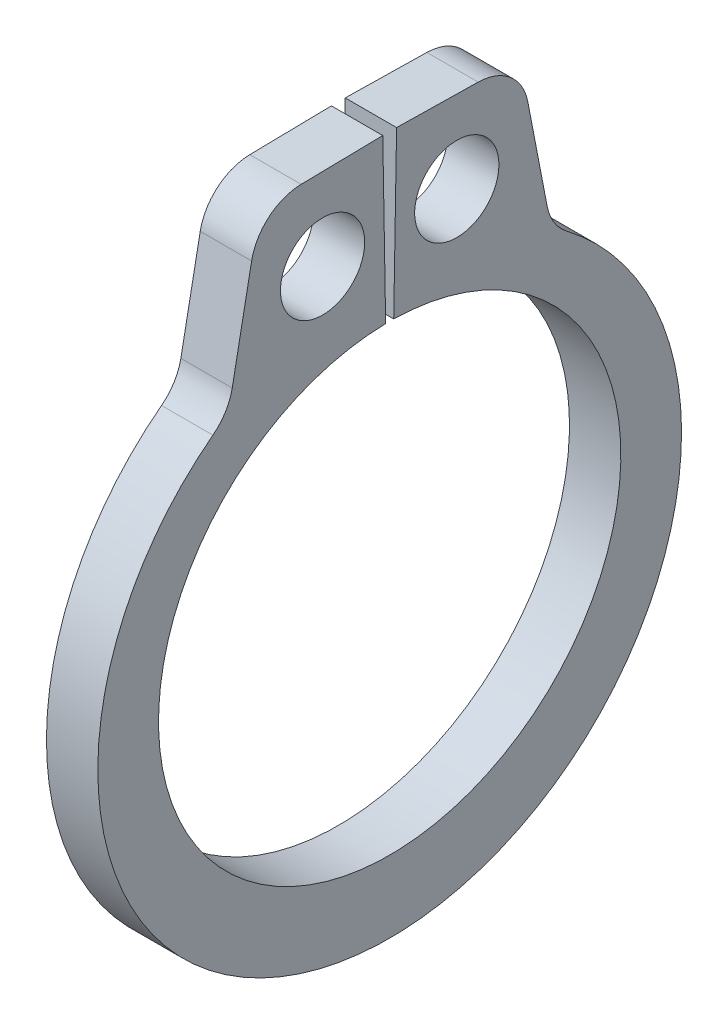
ISO-10303-21;
HEADER;
FILE_DESCRIPTION(('STEP AP214'),'2;1');
FILE_NAME('part.step','',(''),(''),'','','');
FILE_SCHEMA(('AUTOMOTIVE_DESIGN { 1 0 10303 214 1 1 1 1 }'));
ENDSEC;
DATA;
#1=APPLICATION_CONTEXT('core data for automotive mechanical design processes');
#2=APPLICATION_PROTOCOL_DEFINITION('international standard','automotive_design',2000,#1);
#3=PRODUCT_CONTEXT('',#1,'mechanical');
#4=PRODUCT('Part','Part','',(#3));
#5=PRODUCT_RELATED_PRODUCT_CATEGORY('part','',(#4));
#6=PRODUCT_DEFINITION_FORMATION('','',#4);
#7=PRODUCT_DEFINITION_CONTEXT('part definition',#1,'design');
#8=PRODUCT_DEFINITION('design','',#6,#7);
#9=PRODUCT_DEFINITION_SHAPE('','',#8);
#10=(LENGTH_UNIT() NAMED_UNIT(*) SI_UNIT(.MILLI.,.METRE.));
#11=(NAMED_UNIT(*) PLANE_ANGLE_UNIT() SI_UNIT($,.RADIAN.));
#12=(NAMED_UNIT(*) SI_UNIT($,.STERADIAN.) SOLID_ANGLE_UNIT());
#13=UNCERTAINTY_MEASURE_WITH_UNIT(LENGTH_MEASURE(1.E-05),#10,'distance_accuracy_value','');
#14=(GEOMETRIC_REPRESENTATION_CONTEXT(3) GLOBAL_UNCERTAINTY_ASSIGNED_CONTEXT((#13)) GLOBAL_UNIT_ASSIGNED_CONTEXT((#10,
#11,#12)) REPRESENTATION_CONTEXT('',''));
#15=CARTESIAN_POINT('',(0.,0.,0.));
#16=DIRECTION('',(0.,0.,1.));
#17=DIRECTION('',(1.,0.,0.));
#18=AXIS2_PLACEMENT_3D('',#15,#16,#17);
#19=CARTESIAN_POINT('',(0.3175,0.,0.));
#20=DIRECTION('',(1.,0.,0.));
#21=DIRECTION('',(0.,0.,-1.));
#22=AXIS2_PLACEMENT_3D('',#19,#20,#21);
#23=PLANE('',#22);
#24=CARTESIAN_POINT('',(0.3175,3.85961131348306,0.829485840043991));
#25=DIRECTION('',(1.,0.,0.));
#26=DIRECTION('',(0.,0.,-1.));
#27=AXIS2_PLACEMENT_3D('',#24,#25,#26);
#28=CIRCLE('',#27,0.5207);
#29=CARTESIAN_POINT('',(0.3175,3.85961131348306,0.308785840043991));
#30=VERTEX_POINT('',#29);
#31=EDGE_CURVE('E221',#30,#30,#28,.T.);
#32=ORIENTED_EDGE('',*,*,#31,.F.);
#33=EDGE_LOOP('',(#32));
#34=FACE_BOUND('',#33,.T.);
#35=DIRECTION('',(0.,-0.017452406437292,0.999847695156391));
#36=VECTOR('',#35,1.);
#37=CARTESIAN_POINT('',(0.3175,4.88875530546717,0.085333541275098));
#38=LINE('',#37,#36);
#39=CARTESIAN_POINT('',(0.3175,4.88875530546717,0.085333541275098));
#40=VERTEX_POINT('',#39);
#41=CARTESIAN_POINT('',(0.3175,4.87114314790031,1.09433337251507));
#42=VERTEX_POINT('',#41);
#43=EDGE_CURVE('E133',#40,#42,#38,.T.);
#44=ORIENTED_EDGE('',*,*,#43,.T.);
#45=CARTESIAN_POINT('',(0.3175,4.236239861476,1.08325109442739));
#46=DIRECTION('',(1.,0.,0.));
#47=DIRECTION('',(0.,0.,-1.));
#48=AXIS2_PLACEMENT_3D('',#45,#46,#47);
#49=CIRCLE('',#48,0.635);
#50=CARTESIAN_POINT('',(0.3175,4.35665257048609,1.7067298667275));
#51=VERTEX_POINT('',#50);
#52=EDGE_CURVE('E174',#42,#51,#49,.T.);
#53=ORIENTED_EDGE('',*,*,#52,.T.);
#54=DIRECTION('',(0.,-0.981856334330881,0.189626313401717));
#55=VECTOR('',#54,1.);
#56=CARTESIAN_POINT('',(0.3175,4.86215783805674,1.60910142869344));
#57=LINE('',#56,#55);
#58=CARTESIAN_POINT('',(0.3175,3.1162207377056,1.94629497136839));
#59=VERTEX_POINT('',#58);
#60=EDGE_CURVE('E213',#51,#59,#57,.T.);
#61=ORIENTED_EDGE('',*,*,#60,.T.);
#62=CARTESIAN_POINT('',(0.3175,3.23663344671569,2.5697737436685));
#63=DIRECTION('',(1.,0.,0.));
#64=DIRECTION('',(0.,0.,-1.));
#65=AXIS2_PLACEMENT_3D('',#62,#63,#64);
#66=CIRCLE('',#65,0.635);
#67=CARTESIAN_POINT('',(0.3175,2.73137951372647,2.18513954966213));
#68=VERTEX_POINT('',#67);
#69=EDGE_CURVE('E181',#59,#68,#66,.F.);
#70=ORIENTED_EDGE('',*,*,#69,.T.);
#71=CARTESIAN_POINT('',(0.3175,-0.139011025651324,0.));
#72=DIRECTION('',(1.,0.,0.));
#73=DIRECTION('',(0.,0.,-1.));
#74=AXIS2_PLACEMENT_3D('',#71,#72,#73);
#75=CIRCLE('',#74,3.60748897434866);
#76=CARTESIAN_POINT('',(0.3175,2.73137951372647,-2.18513954966213));
#77=VERTEX_POINT('',#76);
#78=EDGE_CURVE('E206',#68,#77,#75,.T.);
#79=ORIENTED_EDGE('',*,*,#78,.T.);
#80=CARTESIAN_POINT('',(0.3175,3.23663344671569,-2.5697737436685));
#81=DIRECTION('',(1.,0.,0.));
#82=DIRECTION('',(0.,0.,-1.));
#83=AXIS2_PLACEMENT_3D('',#80,#81,#82);
#84=CIRCLE('',#83,0.635);
#85=CARTESIAN_POINT('',(0.3175,3.1162207377056,-1.94629497136839));
#86=VERTEX_POINT('',#85);
#87=EDGE_CURVE('E11',#77,#86,#84,.F.);
#88=ORIENTED_EDGE('',*,*,#87,.T.);
#89=DIRECTION('',(0.,0.981856334330881,0.189626313401717));
#90=VECTOR('',#89,1.);
#91=CARTESIAN_POINT('',(0.3175,4.86215783805674,-1.60910142869344));
#92=LINE('',#91,#90);
#93=CARTESIAN_POINT('',(0.3175,4.35665257048609,-1.7067298667275));
#94=VERTEX_POINT('',#93);
#95=EDGE_CURVE('E205',#86,#94,#92,.T.);
#96=ORIENTED_EDGE('',*,*,#95,.T.);
#97=CARTESIAN_POINT('',(0.3175,4.236239861476,-1.08325109442739));
#98=DIRECTION('',(1.,0.,0.));
#99=DIRECTION('',(0.,0.,-1.));
#100=AXIS2_PLACEMENT_3D('',#97,#98,#99);
#101=CIRCLE('',#100,0.635);
#102=CARTESIAN_POINT('',(0.3175,4.87114314790031,-1.09433337251507));
#103=VERTEX_POINT('',#102);
#104=EDGE_CURVE('E49',#94,#103,#101,.T.);
#105=ORIENTED_EDGE('',*,*,#104,.T.);
#106=DIRECTION('',(0.,0.017452406437292,0.999847695156391));
#107=VECTOR('',#106,1.);
#108=CARTESIAN_POINT('',(0.3175,4.88875530546717,-0.085333541275098));
#109=LINE('',#108,#107);
#110=CARTESIAN_POINT('',(0.3175,4.88875530546717,-0.085333541275098));
#111=VERTEX_POINT('',#110);
#112=EDGE_CURVE('E210',#103,#111,#109,.T.);
#113=ORIENTED_EDGE('',*,*,#112,.T.);
#114=DIRECTION('',(0.,-0.999847695156391,0.0174524064372837));
#115=VECTOR('',#114,1.);
#116=CARTESIAN_POINT('',(0.3175,2.85706478890939,-0.0498702513945376));
#117=LINE('',#116,#115);
#118=CARTESIAN_POINT('',(0.3175,2.85706478890939,-0.0498702513945376));
#119=VERTEX_POINT('',#118);
#120=EDGE_CURVE('E139',#111,#119,#117,.T.);
#121=ORIENTED_EDGE('',*,*,#120,.T.);
#122=CARTESIAN_POINT('',(0.3175,0.,0.));
#123=DIRECTION('',(-1.,0.,0.));
#124=DIRECTION('',(0.,0.,-1.));
#125=AXIS2_PLACEMENT_3D('',#122,#123,#124);
#126=CIRCLE('',#125,2.8575);
#127=CARTESIAN_POINT('',(0.3175,2.85706478890939,0.0498702513945376));
#128=VERTEX_POINT('',#127);
#129=EDGE_CURVE('E134',#119,#128,#126,.T.);
#130=ORIENTED_EDGE('',*,*,#129,.T.);
#131=DIRECTION('',(0.,0.999847695156391,0.0174524064372837));
#132=VECTOR('',#131,1.);
#133=CARTESIAN_POINT('',(0.3175,2.85706478890939,0.0498702513945376));
#134=LINE('',#133,#132);
#135=EDGE_CURVE('E125',#128,#40,#134,.T.);
#136=ORIENTED_EDGE('',*,*,#135,.T.);
#137=EDGE_LOOP('',(#44,#53,#61,#70,#79,#88,#96,#105,#113,#121,#130,#136));
#138=FACE_BOUND('',#137,.T.);
#139=CARTESIAN_POINT('',(0.3175,3.85961131348306,-0.829485840043991));
#140=DIRECTION('',(1.,0.,0.));
#141=DIRECTION('',(0.,0.,-1.));
#142=AXIS2_PLACEMENT_3D('',#139,#140,#141);
#143=CIRCLE('',#142,0.5207);
#144=CARTESIAN_POINT('',(0.3175,3.85961131348306,-1.35018584004399));
#145=VERTEX_POINT('',#144);
#146=EDGE_CURVE('E247',#145,#145,#143,.T.);
#147=ORIENTED_EDGE('',*,*,#146,.F.);
#148=EDGE_LOOP('',(#147));
#149=FACE_BOUND('',#148,.T.);
#150=ADVANCED_FACE('F34',(#34,#138,#149),#23,.T.);
#151=CARTESIAN_POINT('',(-0.3175,0.,0.));
#152=DIRECTION('',(1.,0.,0.));
#153=DIRECTION('',(0.,0.,-1.));
#154=AXIS2_PLACEMENT_3D('',#151,#152,#153);
#155=PLANE('',#154);
#156=CARTESIAN_POINT('',(-0.3175,3.85961131348306,0.829485840043991));
#157=DIRECTION('',(1.,0.,0.));
#158=DIRECTION('',(0.,0.,-1.));
#159=AXIS2_PLACEMENT_3D('',#156,#157,#158);
#160=CIRCLE('',#159,0.5207);
#161=CARTESIAN_POINT('',(-0.3175,3.85961131348306,0.308785840043991));
#162=VERTEX_POINT('',#161);
#163=EDGE_CURVE('E244',#162,#162,#160,.T.);
#164=ORIENTED_EDGE('',*,*,#163,.T.);
#165=EDGE_LOOP('',(#164));
#166=FACE_BOUND('',#165,.T.);
#167=DIRECTION('',(0.,-0.981856334330881,0.189626313401717));
#168=VECTOR('',#167,1.);
#169=CARTESIAN_POINT('',(-0.3175,4.86215783805674,1.60910142869344));
#170=LINE('',#169,#168);
#171=CARTESIAN_POINT('',(-0.3175,4.35665257048609,1.7067298667275));
#172=VERTEX_POINT('',#171);
#173=CARTESIAN_POINT('',(-0.3175,3.1162207377056,1.94629497136839));
#174=VERTEX_POINT('',#173);
#175=EDGE_CURVE('E200',#172,#174,#170,.T.);
#176=ORIENTED_EDGE('',*,*,#175,.F.);
#177=CARTESIAN_POINT('',(-0.3175,4.236239861476,1.08325109442739));
#178=DIRECTION('',(1.,0.,0.));
#179=DIRECTION('',(0.,0.,-1.));
#180=AXIS2_PLACEMENT_3D('',#177,#178,#179);
#181=CIRCLE('',#180,0.635);
#182=CARTESIAN_POINT('',(-0.3175,4.87114314790031,1.09433337251507));
#183=VERTEX_POINT('',#182);
#184=EDGE_CURVE('E170',#172,#183,#181,.F.);
#185=ORIENTED_EDGE('',*,*,#184,.T.);
#186=DIRECTION('',(0.,-0.017452406437292,0.999847695156391));
#187=VECTOR('',#186,1.);
#188=CARTESIAN_POINT('',(-0.3175,4.88875530546717,0.085333541275098));
#189=LINE('',#188,#187);
#190=CARTESIAN_POINT('',(-0.3175,4.88875530546717,0.085333541275098));
#191=VERTEX_POINT('',#190);
#192=EDGE_CURVE('E223',#191,#183,#189,.T.);
#193=ORIENTED_EDGE('',*,*,#192,.F.);
#194=DIRECTION('',(0.,0.999847695156391,0.0174524064372837));
#195=VECTOR('',#194,1.);
#196=CARTESIAN_POINT('',(-0.3175,2.85706478890939,0.0498702513945376));
#197=LINE('',#196,#195);
#198=CARTESIAN_POINT('',(-0.3175,2.85706478890939,0.0498702513945376));
#199=VERTEX_POINT('',#198);
#200=EDGE_CURVE('E220',#199,#191,#197,.T.);
#201=ORIENTED_EDGE('',*,*,#200,.F.);
#202=CARTESIAN_POINT('',(-0.3175,0.,0.));
#203=DIRECTION('',(-1.,0.,0.));
#204=DIRECTION('',(0.,0.,-1.));
#205=AXIS2_PLACEMENT_3D('',#202,#203,#204);
#206=CIRCLE('',#205,2.8575);
#207=CARTESIAN_POINT('',(-0.3175,2.85706478890939,-0.0498702513945376));
#208=VERTEX_POINT('',#207);
#209=EDGE_CURVE('E147',#208,#199,#206,.T.);
#210=ORIENTED_EDGE('',*,*,#209,.F.);
#211=DIRECTION('',(0.,-0.999847695156391,0.0174524064372837));
#212=VECTOR('',#211,1.);
#213=CARTESIAN_POINT('',(-0.3175,2.85706478890939,-0.0498702513945376));
#214=LINE('',#213,#212);
#215=CARTESIAN_POINT('',(-0.3175,4.88875530546717,-0.085333541275098));
#216=VERTEX_POINT('',#215);
#217=EDGE_CURVE('E143',#216,#208,#214,.T.);
#218=ORIENTED_EDGE('',*,*,#217,.F.);
#219=DIRECTION('',(0.,0.017452406437292,0.999847695156391));
#220=VECTOR('',#219,1.);
#221=CARTESIAN_POINT('',(-0.3175,4.88875530546717,-0.085333541275098));
#222=LINE('',#221,#220);
#223=CARTESIAN_POINT('',(-0.3175,4.87114314790031,-1.09433337251507));
#224=VERTEX_POINT('',#223);
#225=EDGE_CURVE('E228',#224,#216,#222,.T.);
#226=ORIENTED_EDGE('',*,*,#225,.F.);
#227=CARTESIAN_POINT('',(-0.3175,4.236239861476,-1.08325109442739));
#228=DIRECTION('',(1.,0.,0.));
#229=DIRECTION('',(0.,0.,-1.));
#230=AXIS2_PLACEMENT_3D('',#227,#228,#229);
#231=CIRCLE('',#230,0.635);
#232=CARTESIAN_POINT('',(-0.3175,4.35665257048609,-1.7067298667275));
#233=VERTEX_POINT('',#232);
#234=EDGE_CURVE('E168',#224,#233,#231,.F.);
#235=ORIENTED_EDGE('',*,*,#234,.T.);
#236=DIRECTION('',(0.,0.981856334330881,0.189626313401717));
#237=VECTOR('',#236,1.);
#238=CARTESIAN_POINT('',(-0.3175,4.86215783805674,-1.60910142869344));
#239=LINE('',#238,#237);
#240=CARTESIAN_POINT('',(-0.3175,3.1162207377056,-1.94629497136839));
#241=VERTEX_POINT('',#240);
#242=EDGE_CURVE('E191',#241,#233,#239,.T.);
#243=ORIENTED_EDGE('',*,*,#242,.F.);
#244=CARTESIAN_POINT('',(-0.3175,3.23663344671569,-2.5697737436685));
#245=DIRECTION('',(1.,0.,0.));
#246=DIRECTION('',(0.,0.,-1.));
#247=AXIS2_PLACEMENT_3D('',#244,#245,#246);
#248=CIRCLE('',#247,0.635);
#249=CARTESIAN_POINT('',(-0.3175,2.73137951372647,-2.18513954966213));
#250=VERTEX_POINT('',#249);
#251=EDGE_CURVE('E42',#241,#250,#248,.T.);
#252=ORIENTED_EDGE('',*,*,#251,.T.);
#253=CARTESIAN_POINT('',(-0.3175,-0.139011025651324,0.));
#254=DIRECTION('',(1.,0.,0.));
#255=DIRECTION('',(0.,0.,-1.));
#256=AXIS2_PLACEMENT_3D('',#253,#254,#255);
#257=CIRCLE('',#256,3.60748897434866);
#258=CARTESIAN_POINT('',(-0.3175,2.73137951372647,2.18513954966213));
#259=VERTEX_POINT('',#258);
#260=EDGE_CURVE('E189',#259,#250,#257,.T.);
#261=ORIENTED_EDGE('',*,*,#260,.F.);
#262=CARTESIAN_POINT('',(-0.3175,3.23663344671569,2.5697737436685));
#263=DIRECTION('',(1.,0.,0.));
#264=DIRECTION('',(0.,0.,-1.));
#265=AXIS2_PLACEMENT_3D('',#262,#263,#264);
#266=CIRCLE('',#265,0.635);
#267=EDGE_CURVE('E179',#259,#174,#266,.T.);
#268=ORIENTED_EDGE('',*,*,#267,.T.);
#269=EDGE_LOOP('',(#176,#185,#193,#201,#210,#218,#226,#235,#243,#252,#261,#268));
#270=FACE_BOUND('',#269,.T.);
#271=CARTESIAN_POINT('',(-0.3175,3.85961131348306,-0.829485840043991));
#272=DIRECTION('',(1.,0.,0.));
#273=DIRECTION('',(0.,0.,-1.));
#274=AXIS2_PLACEMENT_3D('',#271,#272,#273);
#275=CIRCLE('',#274,0.5207);
#276=CARTESIAN_POINT('',(-0.3175,3.85961131348306,-1.35018584004399));
#277=VERTEX_POINT('',#276);
#278=EDGE_CURVE('E250',#277,#277,#275,.T.);
#279=ORIENTED_EDGE('',*,*,#278,.T.);
#280=EDGE_LOOP('',(#279));
#281=FACE_BOUND('',#280,.T.);
#282=ADVANCED_FACE('F187',(#166,#270,#281),#155,.F.);
#283=CARTESIAN_POINT('',(0.3175,0.,0.));
#284=DIRECTION('',(-1.,0.,0.));
#285=DIRECTION('',(0.,0.,1.));
#286=AXIS2_PLACEMENT_3D('',#283,#284,#285);
#287=CYLINDRICAL_SURFACE('',#286,2.8575);
#288=ORIENTED_EDGE('',*,*,#209,.T.);
#289=DIRECTION('',(-1.,0.,0.));
#290=VECTOR('',#289,1.);
#291=CARTESIAN_POINT('',(0.3175,2.85706478890939,0.0498702513945376));
#292=LINE('',#291,#290);
#293=EDGE_CURVE('E129',#128,#199,#292,.T.);
#294=ORIENTED_EDGE('',*,*,#293,.F.);
#295=ORIENTED_EDGE('',*,*,#129,.F.);
#296=DIRECTION('',(-1.,0.,0.));
#297=VECTOR('',#296,1.);
#298=CARTESIAN_POINT('',(0.3175,2.85706478890939,-0.0498702513945376));
#299=LINE('',#298,#297);
#300=EDGE_CURVE('E218',#119,#208,#299,.T.);
#301=ORIENTED_EDGE('',*,*,#300,.T.);
#302=EDGE_LOOP('',(#288,#294,#295,#301));
#303=FACE_BOUND('',#302,.T.);
#304=ADVANCED_FACE('F145',(#303),#287,.F.);
#305=CARTESIAN_POINT('',(0.3175,2.85706478890939,0.0498702513945376));
#306=DIRECTION('',(0.,-0.0174524064372837,0.999847695156391));
#307=DIRECTION('',(0.,-0.999847695156391,-0.0174524064372837));
#308=AXIS2_PLACEMENT_3D('',#305,#306,#307);
#309=PLANE('',#308);
#310=ORIENTED_EDGE('',*,*,#200,.T.);
#311=DIRECTION('',(-1.,0.,0.));
#312=VECTOR('',#311,1.);
#313=CARTESIAN_POINT('',(0.3175,4.88875530546717,0.085333541275098));
#314=LINE('',#313,#312);
#315=EDGE_CURVE('E132',#40,#191,#314,.T.);
#316=ORIENTED_EDGE('',*,*,#315,.F.);
#317=ORIENTED_EDGE('',*,*,#135,.F.);
#318=ORIENTED_EDGE('',*,*,#293,.T.);
#319=EDGE_LOOP('',(#310,#316,#317,#318));
#320=FACE_BOUND('',#319,.T.);
#321=ADVANCED_FACE('F127',(#320),#309,.F.);
#322=CARTESIAN_POINT('',(0.3175,4.88875530546717,0.085333541275098));
#323=DIRECTION('',(0.,-0.999847695156391,-0.017452406437292));
#324=DIRECTION('',(0.,0.017452406437292,-0.999847695156391));
#325=AXIS2_PLACEMENT_3D('',#322,#323,#324);
#326=PLANE('',#325);
#327=ORIENTED_EDGE('',*,*,#192,.T.);
#328=DIRECTION('',(-1.,0.,0.));
#329=VECTOR('',#328,1.);
#330=CARTESIAN_POINT('',(0.3175,4.87114314790031,1.09433337251507));
#331=LINE('',#330,#329);
#332=EDGE_CURVE('E57',#183,#42,#331,.F.);
#333=ORIENTED_EDGE('',*,*,#332,.T.);
#334=ORIENTED_EDGE('',*,*,#43,.F.);
#335=ORIENTED_EDGE('',*,*,#315,.T.);
#336=EDGE_LOOP('',(#327,#333,#334,#335));
#337=FACE_BOUND('',#336,.T.);
#338=ADVANCED_FACE('F239',(#337),#326,.F.);
#339=CARTESIAN_POINT('',(0.3175,4.86215783805674,1.60910142869344));
#340=DIRECTION('',(0.,-0.189626313401717,-0.98185633433088));
#341=DIRECTION('',(0.,0.981856334330881,-0.189626313401717));
#342=AXIS2_PLACEMENT_3D('',#339,#340,#341);
#343=PLANE('',#342);
#344=ORIENTED_EDGE('',*,*,#175,.T.);
#345=DIRECTION('',(1.,0.,0.));
#346=VECTOR('',#345,1.);
#347=CARTESIAN_POINT('',(0.3175,3.1162207377056,1.94629497136839));
#348=LINE('',#347,#346);
#349=EDGE_CURVE('E161',#174,#59,#348,.T.);
#350=ORIENTED_EDGE('',*,*,#349,.T.);
#351=ORIENTED_EDGE('',*,*,#60,.F.);
#352=DIRECTION('',(-1.,0.,0.));
#353=VECTOR('',#352,1.);
#354=CARTESIAN_POINT('',(0.3175,4.35665257048609,1.7067298667275));
#355=LINE('',#354,#353);
#356=EDGE_CURVE('E158',#51,#172,#355,.T.);
#357=ORIENTED_EDGE('',*,*,#356,.T.);
#358=EDGE_LOOP('',(#344,#350,#351,#357));
#359=FACE_BOUND('',#358,.T.);
#360=ADVANCED_FACE('F280',(#359),#343,.F.);
#361=CARTESIAN_POINT('',(0.3175,-0.139011025651324,0.));
#362=DIRECTION('',(-1.,0.,0.));
#363=DIRECTION('',(0.,0.,1.));
#364=AXIS2_PLACEMENT_3D('',#361,#362,#363);
#365=CYLINDRICAL_SURFACE('',#364,3.60748897434866);
#366=ORIENTED_EDGE('',*,*,#78,.F.);
#367=DIRECTION('',(-1.,0.,0.));
#368=VECTOR('',#367,1.);
#369=CARTESIAN_POINT('',(0.3175,2.73137951372647,2.18513954966213));
#370=LINE('',#369,#368);
#371=EDGE_CURVE('E150',#68,#259,#370,.T.);
#372=ORIENTED_EDGE('',*,*,#371,.T.);
#373=ORIENTED_EDGE('',*,*,#260,.T.);
#374=DIRECTION('',(-1.,0.,0.));
#375=VECTOR('',#374,1.);
#376=CARTESIAN_POINT('',(0.3175,2.73137951372647,-2.18513954966213));
#377=LINE('',#376,#375);
#378=EDGE_CURVE('E148',#250,#77,#377,.F.);
#379=ORIENTED_EDGE('',*,*,#378,.T.);
#380=EDGE_LOOP('',(#366,#372,#373,#379));
#381=FACE_BOUND('',#380,.T.);
#382=ADVANCED_FACE('F197',(#381),#365,.T.);
#383=CARTESIAN_POINT('',(0.3175,4.86215783805674,-1.60910142869344));
#384=DIRECTION('',(0.,-0.189626313401717,0.98185633433088));
#385=DIRECTION('',(0.,-0.981856334330881,-0.189626313401717));
#386=AXIS2_PLACEMENT_3D('',#383,#384,#385);
#387=PLANE('',#386);
#388=ORIENTED_EDGE('',*,*,#95,.F.);
#389=DIRECTION('',(1.,0.,0.));
#390=VECTOR('',#389,1.);
#391=CARTESIAN_POINT('',(-0.3175,3.1162207377056,-1.94629497136839));
#392=LINE('',#391,#390);
#393=EDGE_CURVE('E165',#86,#241,#392,.F.);
#394=ORIENTED_EDGE('',*,*,#393,.T.);
#395=ORIENTED_EDGE('',*,*,#242,.T.);
#396=DIRECTION('',(-1.,0.,0.));
#397=VECTOR('',#396,1.);
#398=CARTESIAN_POINT('',(0.3175,4.35665257048609,-1.7067298667275));
#399=LINE('',#398,#397);
#400=EDGE_CURVE('E163',#233,#94,#399,.F.);
#401=ORIENTED_EDGE('',*,*,#400,.T.);
#402=EDGE_LOOP('',(#388,#394,#395,#401));
#403=FACE_BOUND('',#402,.T.);
#404=ADVANCED_FACE('F208',(#403),#387,.F.);
#405=CARTESIAN_POINT('',(0.3175,4.88875530546717,-0.085333541275098));
#406=DIRECTION('',(0.,-0.999847695156391,0.017452406437292));
#407=DIRECTION('',(0.,-0.017452406437292,-0.999847695156391));
#408=AXIS2_PLACEMENT_3D('',#405,#406,#407);
#409=PLANE('',#408);
#410=ORIENTED_EDGE('',*,*,#112,.F.);
#411=DIRECTION('',(-1.,0.,0.));
#412=VECTOR('',#411,1.);
#413=CARTESIAN_POINT('',(0.3175,4.87114314790031,-1.09433337251507));
#414=LINE('',#413,#412);
#415=EDGE_CURVE('E176',#103,#224,#414,.T.);
#416=ORIENTED_EDGE('',*,*,#415,.T.);
#417=ORIENTED_EDGE('',*,*,#225,.T.);
#418=DIRECTION('',(-1.,0.,0.));
#419=VECTOR('',#418,1.);
#420=CARTESIAN_POINT('',(0.3175,4.88875530546717,-0.085333541275098));
#421=LINE('',#420,#419);
#422=EDGE_CURVE('E152',#111,#216,#421,.T.);
#423=ORIENTED_EDGE('',*,*,#422,.F.);
#424=EDGE_LOOP('',(#410,#416,#417,#423));
#425=FACE_BOUND('',#424,.T.);
#426=ADVANCED_FACE('F273',(#425),#409,.F.);
#427=CARTESIAN_POINT('',(0.3175,2.85706478890939,-0.0498702513945376));
#428=DIRECTION('',(0.,-0.0174524064372837,-0.999847695156391));
#429=DIRECTION('',(0.,0.999847695156391,-0.0174524064372837));
#430=AXIS2_PLACEMENT_3D('',#427,#428,#429);
#431=PLANE('',#430);
#432=ORIENTED_EDGE('',*,*,#217,.T.);
#433=ORIENTED_EDGE('',*,*,#300,.F.);
#434=ORIENTED_EDGE('',*,*,#120,.F.);
#435=ORIENTED_EDGE('',*,*,#422,.T.);
#436=EDGE_LOOP('',(#432,#433,#434,#435));
#437=FACE_BOUND('',#436,.T.);
#438=ADVANCED_FACE('F235',(#437),#431,.F.);
#439=CARTESIAN_POINT('',(0.3175,3.85961131348306,0.829485840043991));
#440=DIRECTION('',(-1.,0.,0.));
#441=DIRECTION('',(0.,0.,1.));
#442=AXIS2_PLACEMENT_3D('',#439,#440,#441);
#443=CYLINDRICAL_SURFACE('',#442,0.5207);
#444=ORIENTED_EDGE('',*,*,#31,.T.);
#445=EDGE_LOOP('',(#444));
#446=FACE_BOUND('',#445,.T.);
#447=ORIENTED_EDGE('',*,*,#163,.F.);
#448=EDGE_LOOP('',(#447));
#449=FACE_BOUND('',#448,.T.);
#450=ADVANCED_FACE('F268',(#446,#449),#443,.F.);
#451=CARTESIAN_POINT('',(0.3175,3.85961131348306,-0.829485840043991));
#452=DIRECTION('',(-1.,0.,0.));
#453=DIRECTION('',(0.,0.,1.));
#454=AXIS2_PLACEMENT_3D('',#451,#452,#453);
#455=CYLINDRICAL_SURFACE('',#454,0.5207);
#456=ORIENTED_EDGE('',*,*,#146,.T.);
#457=EDGE_LOOP('',(#456));
#458=FACE_BOUND('',#457,.T.);
#459=ORIENTED_EDGE('',*,*,#278,.F.);
#460=EDGE_LOOP('',(#459));
#461=FACE_BOUND('',#460,.T.);
#462=ADVANCED_FACE('F256',(#458,#461),#455,.F.);
#463=CARTESIAN_POINT('',(0.3175,3.23663344671569,2.5697737436685));
#464=DIRECTION('',(-1.,0.,0.));
#465=DIRECTION('',(0.,0.,1.));
#466=AXIS2_PLACEMENT_3D('',#463,#464,#465);
#467=CYLINDRICAL_SURFACE('',#466,0.635);
#468=ORIENTED_EDGE('',*,*,#69,.F.);
#469=ORIENTED_EDGE('',*,*,#349,.F.);
#470=ORIENTED_EDGE('',*,*,#267,.F.);
#471=ORIENTED_EDGE('',*,*,#371,.F.);
#472=EDGE_LOOP('',(#468,#469,#470,#471));
#473=FACE_BOUND('',#472,.T.);
#474=ADVANCED_FACE('F290',(#473),#467,.F.);
#475=CARTESIAN_POINT('',(0.3175,3.23663344671569,-2.5697737436685));
#476=DIRECTION('',(-1.,0.,0.));
#477=DIRECTION('',(0.,0.,1.));
#478=AXIS2_PLACEMENT_3D('',#475,#476,#477);
#479=CYLINDRICAL_SURFACE('',#478,0.635);
#480=ORIENTED_EDGE('',*,*,#87,.F.);
#481=ORIENTED_EDGE('',*,*,#378,.F.);
#482=ORIENTED_EDGE('',*,*,#251,.F.);
#483=ORIENTED_EDGE('',*,*,#393,.F.);
#484=EDGE_LOOP('',(#480,#481,#482,#483));
#485=FACE_BOUND('',#484,.T.);
#486=ADVANCED_FACE('F203',(#485),#479,.F.);
#487=CARTESIAN_POINT('',(0.3175,4.236239861476,1.08325109442739));
#488=DIRECTION('',(-1.,0.,0.));
#489=DIRECTION('',(0.,0.,1.));
#490=AXIS2_PLACEMENT_3D('',#487,#488,#489);
#491=CYLINDRICAL_SURFACE('',#490,0.635);
#492=ORIENTED_EDGE('',*,*,#52,.F.);
#493=ORIENTED_EDGE('',*,*,#332,.F.);
#494=ORIENTED_EDGE('',*,*,#184,.F.);
#495=ORIENTED_EDGE('',*,*,#356,.F.);
#496=EDGE_LOOP('',(#492,#493,#494,#495));
#497=FACE_BOUND('',#496,.T.);
#498=ADVANCED_FACE('F295',(#497),#491,.T.);
#499=CARTESIAN_POINT('',(0.3175,4.236239861476,-1.08325109442739));
#500=DIRECTION('',(-1.,0.,0.));
#501=DIRECTION('',(0.,0.,1.));
#502=AXIS2_PLACEMENT_3D('',#499,#500,#501);
#503=CYLINDRICAL_SURFACE('',#502,0.635);
#504=ORIENTED_EDGE('',*,*,#104,.F.);
#505=ORIENTED_EDGE('',*,*,#400,.F.);
#506=ORIENTED_EDGE('',*,*,#234,.F.);
#507=ORIENTED_EDGE('',*,*,#415,.F.);
#508=EDGE_LOOP('',(#504,#505,#506,#507));
#509=FACE_BOUND('',#508,.T.);
#510=ADVANCED_FACE('F36',(#509),#503,.T.);
#511=CLOSED_SHELL('',(#150,#282,#304,#321,#338,#360,#382,#404,#426,#438,#450,#462,#474,#486,
#498,#510));
#512=MANIFOLD_SOLID_BREP('B2',#511);
#513=ADVANCED_BREP_SHAPE_REPRESENTATION('',(#18,#512),#14);
#514=SHAPE_DEFINITION_REPRESENTATION(#9,#513);
ENDSEC;
END-ISO-10303-21;
